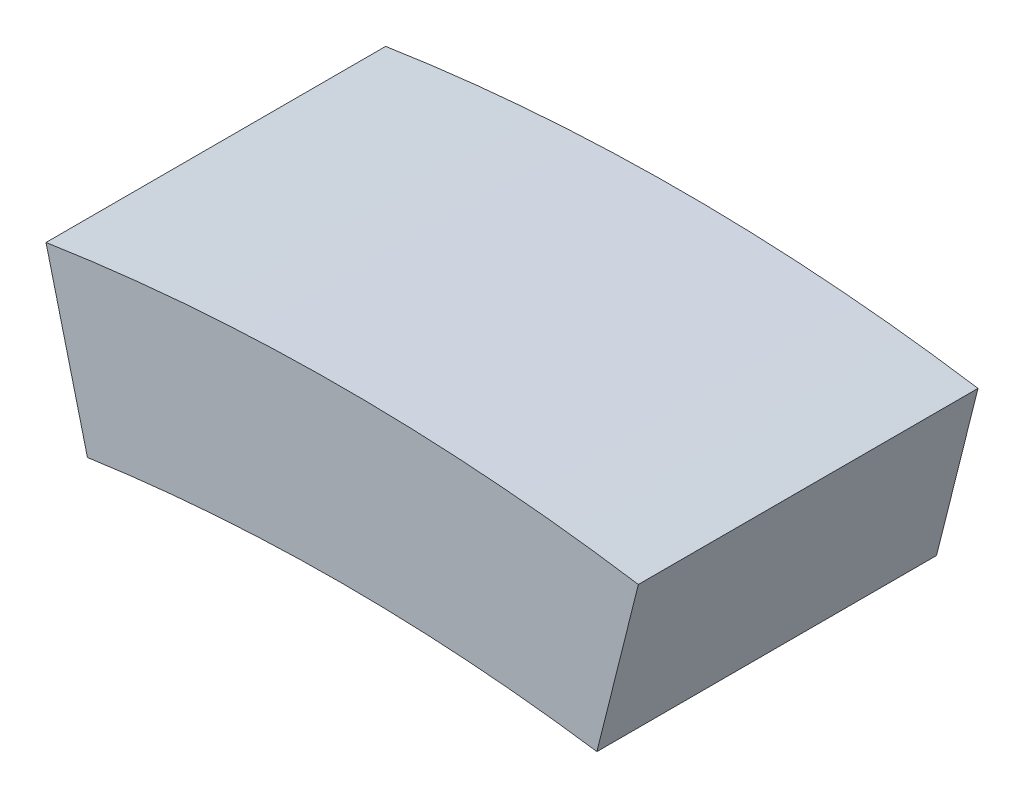
ISO-10303-21;
HEADER;
FILE_DESCRIPTION(('STEP AP214'),'2;1');
FILE_NAME('part.step','',(''),(''),'','','');
FILE_SCHEMA(('AUTOMOTIVE_DESIGN { 1 0 10303 214 1 1 1 1 }'));
ENDSEC;
DATA;
#1=APPLICATION_CONTEXT('core data for automotive mechanical design processes');
#2=APPLICATION_PROTOCOL_DEFINITION('international standard','automotive_design',2000,#1);
#3=PRODUCT_CONTEXT('',#1,'mechanical');
#4=PRODUCT('Part','Part','',(#3));
#5=PRODUCT_RELATED_PRODUCT_CATEGORY('part','',(#4));
#6=PRODUCT_DEFINITION_FORMATION('','',#4);
#7=PRODUCT_DEFINITION_CONTEXT('part definition',#1,'design');
#8=PRODUCT_DEFINITION('design','',#6,#7);
#9=PRODUCT_DEFINITION_SHAPE('','',#8);
#10=(LENGTH_UNIT() NAMED_UNIT(*) SI_UNIT(.MILLI.,.METRE.));
#11=(NAMED_UNIT(*) PLANE_ANGLE_UNIT() SI_UNIT($,.RADIAN.));
#12=(NAMED_UNIT(*) SI_UNIT($,.STERADIAN.) SOLID_ANGLE_UNIT());
#13=UNCERTAINTY_MEASURE_WITH_UNIT(LENGTH_MEASURE(1.E-05),#10,'distance_accuracy_value','');
#14=(GEOMETRIC_REPRESENTATION_CONTEXT(3) GLOBAL_UNCERTAINTY_ASSIGNED_CONTEXT((#13)) GLOBAL_UNIT_ASSIGNED_CONTEXT((#10,
#11,#12)) REPRESENTATION_CONTEXT('',''));
#15=CARTESIAN_POINT('',(0.,0.,0.));
#16=DIRECTION('',(0.,0.,1.));
#17=DIRECTION('',(1.,0.,0.));
#18=AXIS2_PLACEMENT_3D('',#15,#16,#17);
#19=CARTESIAN_POINT('',(15.,-103.23952204297,10.));
#20=DIRECTION('',(0.,0.,-1.));
#21=DIRECTION('',(-1.,0.,0.));
#22=AXIS2_PLACEMENT_3D('',#19,#20,#21);
#23=CYLINDRICAL_SURFACE('',#22,114.32353);
#24=CARTESIAN_POINT('',(15.,-103.23952204297,-10.));
#25=DIRECTION('',(0.,0.,1.));
#26=DIRECTION('',(1.,0.,0.));
#27=AXIS2_PLACEMENT_3D('',#24,#25,#26);
#28=CIRCLE('',#27,114.32353);
#29=CARTESIAN_POINT('',(32.4409213135452,9.74580344399583,-10.));
#30=VERTEX_POINT('',#29);
#31=CARTESIAN_POINT('',(-2.44092131354519,9.74580344399583,-10.));
#32=VERTEX_POINT('',#31);
#33=EDGE_CURVE('E97',#30,#32,#28,.T.);
#34=ORIENTED_EDGE('',*,*,#33,.T.);
#35=DIRECTION('',(0.,0.,-1.));
#36=VECTOR('',#35,1.);
#37=CARTESIAN_POINT('',(-2.44092131354519,9.74580344399583,10.));
#38=LINE('',#37,#36);
#39=CARTESIAN_POINT('',(-2.44092131354519,9.74580344399583,10.));
#40=VERTEX_POINT('',#39);
#41=EDGE_CURVE('E11',#40,#32,#38,.T.);
#42=ORIENTED_EDGE('',*,*,#41,.F.);
#43=CARTESIAN_POINT('',(15.,-103.23952204297,10.));
#44=DIRECTION('',(0.,0.,1.));
#45=DIRECTION('',(1.,0.,0.));
#46=AXIS2_PLACEMENT_3D('',#43,#44,#45);
#47=CIRCLE('',#46,114.32353);
#48=CARTESIAN_POINT('',(32.4409213135452,9.74580344399583,10.));
#49=VERTEX_POINT('',#48);
#50=EDGE_CURVE('E85',#49,#40,#47,.T.);
#51=ORIENTED_EDGE('',*,*,#50,.F.);
#52=DIRECTION('',(0.,0.,-1.));
#53=VECTOR('',#52,1.);
#54=CARTESIAN_POINT('',(32.4409213135452,9.74580344399583,10.));
#55=LINE('',#54,#53);
#56=EDGE_CURVE('E93',#49,#30,#55,.T.);
#57=ORIENTED_EDGE('',*,*,#56,.T.);
#58=EDGE_LOOP('',(#34,#42,#51,#57));
#59=FACE_BOUND('',#58,.T.);
#60=ADVANCED_FACE('F34',(#59),#23,.T.);
#61=CARTESIAN_POINT('',(0.,0.,10.));
#62=DIRECTION('',(0.970037712925659,0.242954389756507,0.));
#63=DIRECTION('',(-0.242954389756507,0.970037712925659,0.));
#64=AXIS2_PLACEMENT_3D('',#61,#62,#63);
#65=PLANE('',#64);
#66=DIRECTION('',(0.242954389756507,-0.970037712925659,0.));
#67=VECTOR('',#66,1.);
#68=CARTESIAN_POINT('',(0.,0.,-10.));
#69=LINE('',#68,#67);
#70=CARTESIAN_POINT('',(0.,0.,-10.));
#71=VERTEX_POINT('',#70);
#72=EDGE_CURVE('E89',#32,#71,#69,.T.);
#73=ORIENTED_EDGE('',*,*,#72,.T.);
#74=DIRECTION('',(0.,0.,-1.));
#75=VECTOR('',#74,1.);
#76=CARTESIAN_POINT('',(0.,0.,10.));
#77=LINE('',#76,#75);
#78=CARTESIAN_POINT('',(0.,0.,10.));
#79=VERTEX_POINT('',#78);
#80=EDGE_CURVE('E42',#79,#71,#77,.T.);
#81=ORIENTED_EDGE('',*,*,#80,.F.);
#82=DIRECTION('',(0.242954389756507,-0.970037712925659,0.));
#83=VECTOR('',#82,1.);
#84=CARTESIAN_POINT('',(0.,0.,10.));
#85=LINE('',#84,#83);
#86=EDGE_CURVE('E80',#40,#79,#85,.T.);
#87=ORIENTED_EDGE('',*,*,#86,.F.);
#88=ORIENTED_EDGE('',*,*,#41,.T.);
#89=EDGE_LOOP('',(#73,#81,#87,#88));
#90=FACE_BOUND('',#89,.T.);
#91=ADVANCED_FACE('F88',(#90),#65,.F.);
#92=CARTESIAN_POINT('',(15.,-103.23952204297,10.));
#93=DIRECTION('',(0.,0.,-1.));
#94=DIRECTION('',(-1.,0.,0.));
#95=AXIS2_PLACEMENT_3D('',#92,#93,#94);
#96=CYLINDRICAL_SURFACE('',#95,104.32353);
#97=CARTESIAN_POINT('',(15.,-103.23952204297,-10.));
#98=DIRECTION('',(0.,0.,-1.));
#99=DIRECTION('',(1.,0.,0.));
#100=AXIS2_PLACEMENT_3D('',#97,#98,#99);
#101=CIRCLE('',#100,104.32353);
#102=CARTESIAN_POINT('',(30.,0.,-10.));
#103=VERTEX_POINT('',#102);
#104=EDGE_CURVE('E67',#71,#103,#101,.T.);
#105=ORIENTED_EDGE('',*,*,#104,.T.);
#106=DIRECTION('',(0.,0.,-1.));
#107=VECTOR('',#106,1.);
#108=CARTESIAN_POINT('',(30.,0.,10.));
#109=LINE('',#108,#107);
#110=CARTESIAN_POINT('',(30.,0.,10.));
#111=VERTEX_POINT('',#110);
#112=EDGE_CURVE('E90',#111,#103,#109,.T.);
#113=ORIENTED_EDGE('',*,*,#112,.F.);
#114=CARTESIAN_POINT('',(15.,-103.23952204297,10.));
#115=DIRECTION('',(0.,0.,-1.));
#116=DIRECTION('',(1.,0.,0.));
#117=AXIS2_PLACEMENT_3D('',#114,#115,#116);
#118=CIRCLE('',#117,104.32353);
#119=EDGE_CURVE('E83',#79,#111,#118,.T.);
#120=ORIENTED_EDGE('',*,*,#119,.F.);
#121=ORIENTED_EDGE('',*,*,#80,.T.);
#122=EDGE_LOOP('',(#105,#113,#120,#121));
#123=FACE_BOUND('',#122,.T.);
#124=ADVANCED_FACE('F91',(#123),#96,.F.);
#125=CARTESIAN_POINT('',(30.,0.,10.));
#126=DIRECTION('',(-0.970037712925659,0.242954389756507,0.));
#127=DIRECTION('',(-0.242954389756507,-0.970037712925659,0.));
#128=AXIS2_PLACEMENT_3D('',#125,#126,#127);
#129=PLANE('',#128);
#130=DIRECTION('',(0.242954389756507,0.970037712925659,0.));
#131=VECTOR('',#130,1.);
#132=CARTESIAN_POINT('',(30.,0.,-10.));
#133=LINE('',#132,#131);
#134=EDGE_CURVE('E73',#103,#30,#133,.T.);
#135=ORIENTED_EDGE('',*,*,#134,.T.);
#136=ORIENTED_EDGE('',*,*,#56,.F.);
#137=DIRECTION('',(0.242954389756507,0.970037712925659,0.));
#138=VECTOR('',#137,1.);
#139=CARTESIAN_POINT('',(30.,0.,10.));
#140=LINE('',#139,#138);
#141=EDGE_CURVE('E50',#111,#49,#140,.T.);
#142=ORIENTED_EDGE('',*,*,#141,.F.);
#143=ORIENTED_EDGE('',*,*,#112,.T.);
#144=EDGE_LOOP('',(#135,#136,#142,#143));
#145=FACE_BOUND('',#144,.T.);
#146=ADVANCED_FACE('F104',(#145),#129,.F.);
#147=CARTESIAN_POINT('',(15.,-103.23952204297,10.));
#148=DIRECTION('',(0.,0.,1.));
#149=DIRECTION('',(1.,0.,0.));
#150=AXIS2_PLACEMENT_3D('',#147,#148,#149);
#151=PLANE('',#150);
#152=ORIENTED_EDGE('',*,*,#50,.T.);
#153=ORIENTED_EDGE('',*,*,#86,.T.);
#154=ORIENTED_EDGE('',*,*,#119,.T.);
#155=ORIENTED_EDGE('',*,*,#141,.T.);
#156=EDGE_LOOP('',(#152,#153,#154,#155));
#157=FACE_BOUND('',#156,.T.);
#158=ADVANCED_FACE('F81',(#157),#151,.T.);
#159=CARTESIAN_POINT('',(15.,-103.23952204297,-10.));
#160=DIRECTION('',(0.,0.,1.));
#161=DIRECTION('',(1.,0.,0.));
#162=AXIS2_PLACEMENT_3D('',#159,#160,#161);
#163=PLANE('',#162);
#164=ORIENTED_EDGE('',*,*,#33,.F.);
#165=ORIENTED_EDGE('',*,*,#134,.F.);
#166=ORIENTED_EDGE('',*,*,#104,.F.);
#167=ORIENTED_EDGE('',*,*,#72,.F.);
#168=EDGE_LOOP('',(#164,#165,#166,#167));
#169=FACE_BOUND('',#168,.T.);
#170=ADVANCED_FACE('F107',(#169),#163,.F.);
#171=CLOSED_SHELL('',(#60,#91,#124,#146,#158,#170));
#172=MANIFOLD_SOLID_BREP('B2',#171);
#173=ADVANCED_BREP_SHAPE_REPRESENTATION('',(#18,#172),#14);
#174=SHAPE_DEFINITION_REPRESENTATION(#9,#173);
ENDSEC;
END-ISO-10303-21;
